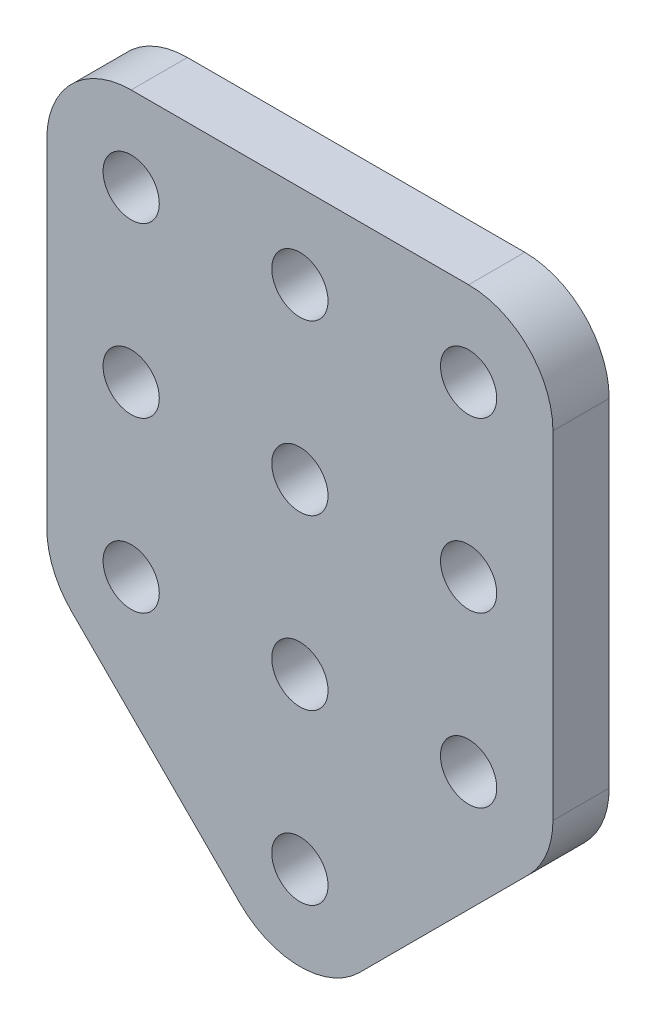
ISO-10303-21;
HEADER;
FILE_DESCRIPTION(('STEP AP214'),'2;1');
FILE_NAME('part.step','',(''),(''),'','','');
FILE_SCHEMA(('AUTOMOTIVE_DESIGN { 1 0 10303 214 1 1 1 1 }'));
ENDSEC;
DATA;
#1=APPLICATION_CONTEXT('core data for automotive mechanical design processes');
#2=APPLICATION_PROTOCOL_DEFINITION('international standard','automotive_design',2000,#1);
#3=PRODUCT_CONTEXT('',#1,'mechanical');
#4=PRODUCT('Part','Part','',(#3));
#5=PRODUCT_RELATED_PRODUCT_CATEGORY('part','',(#4));
#6=PRODUCT_DEFINITION_FORMATION('','',#4);
#7=PRODUCT_DEFINITION_CONTEXT('part definition',#1,'design');
#8=PRODUCT_DEFINITION('design','',#6,#7);
#9=PRODUCT_DEFINITION_SHAPE('','',#8);
#10=(LENGTH_UNIT() NAMED_UNIT(*) SI_UNIT(.MILLI.,.METRE.));
#11=(NAMED_UNIT(*) PLANE_ANGLE_UNIT() SI_UNIT($,.RADIAN.));
#12=(NAMED_UNIT(*) SI_UNIT($,.STERADIAN.) SOLID_ANGLE_UNIT());
#13=UNCERTAINTY_MEASURE_WITH_UNIT(LENGTH_MEASURE(1.E-05),#10,'distance_accuracy_value','');
#14=(GEOMETRIC_REPRESENTATION_CONTEXT(3) GLOBAL_UNCERTAINTY_ASSIGNED_CONTEXT((#13)) GLOBAL_UNIT_ASSIGNED_CONTEXT((#10,
#11,#12)) REPRESENTATION_CONTEXT('',''));
#15=CARTESIAN_POINT('',(0.,0.,0.));
#16=DIRECTION('',(0.,0.,1.));
#17=DIRECTION('',(1.,0.,0.));
#18=AXIS2_PLACEMENT_3D('',#15,#16,#17);
#19=CARTESIAN_POINT('',(187.7270545748,195.1787200631,3.));
#20=DIRECTION('',(0.,0.,1.));
#21=DIRECTION('',(1.,0.,0.));
#22=AXIS2_PLACEMENT_3D('',#19,#20,#21);
#23=PLANE('',#22);
#24=CARTESIAN_POINT('',(178.7270545748,222.1787200631,3.));
#25=DIRECTION('',(0.,0.,1.));
#26=DIRECTION('',(1.,0.,0.));
#27=AXIS2_PLACEMENT_3D('',#24,#25,#26);
#28=CIRCLE('',#27,1.5);
#29=CARTESIAN_POINT('',(180.2270545748,222.1787200631,3.));
#30=VERTEX_POINT('',#29);
#31=EDGE_CURVE('E253',#30,#30,#28,.T.);
#32=ORIENTED_EDGE('',*,*,#31,.F.);
#33=EDGE_LOOP('',(#32));
#34=FACE_BOUND('',#33,.T.);
#35=CARTESIAN_POINT('',(196.7270545748,204.1787200631,3.));
#36=DIRECTION('',(0.,0.,1.));
#37=DIRECTION('',(1.,0.,0.));
#38=AXIS2_PLACEMENT_3D('',#35,#36,#37);
#39=CIRCLE('',#38,1.5);
#40=CARTESIAN_POINT('',(198.2270545748,204.1787200631,3.));
#41=VERTEX_POINT('',#40);
#42=EDGE_CURVE('E241',#41,#41,#39,.T.);
#43=ORIENTED_EDGE('',*,*,#42,.F.);
#44=EDGE_LOOP('',(#43));
#45=FACE_BOUND('',#44,.T.);
#46=CARTESIAN_POINT('',(196.7270545748,213.1787200631,3.));
#47=DIRECTION('',(0.,0.,1.));
#48=DIRECTION('',(1.,0.,0.));
#49=AXIS2_PLACEMENT_3D('',#46,#47,#48);
#50=CIRCLE('',#49,1.5);
#51=CARTESIAN_POINT('',(198.2270545748,213.1787200631,3.));
#52=VERTEX_POINT('',#51);
#53=EDGE_CURVE('E229',#52,#52,#50,.T.);
#54=ORIENTED_EDGE('',*,*,#53,.F.);
#55=EDGE_LOOP('',(#54));
#56=FACE_BOUND('',#55,.T.);
#57=CARTESIAN_POINT('',(187.7270545748,213.1787200631,3.));
#58=DIRECTION('',(0.,0.,1.));
#59=DIRECTION('',(1.,0.,0.));
#60=AXIS2_PLACEMENT_3D('',#57,#58,#59);
#61=CIRCLE('',#60,1.5);
#62=CARTESIAN_POINT('',(189.2270545748,213.1787200631,3.));
#63=VERTEX_POINT('',#62);
#64=EDGE_CURVE('E217',#63,#63,#61,.T.);
#65=ORIENTED_EDGE('',*,*,#64,.F.);
#66=EDGE_LOOP('',(#65));
#67=FACE_BOUND('',#66,.T.);
#68=CARTESIAN_POINT('',(187.7270545748,204.1787200631,3.));
#69=DIRECTION('',(0.,0.,1.));
#70=DIRECTION('',(1.,0.,0.));
#71=AXIS2_PLACEMENT_3D('',#68,#69,#70);
#72=CIRCLE('',#71,1.5);
#73=CARTESIAN_POINT('',(189.2270545748,204.1787200631,3.));
#74=VERTEX_POINT('',#73);
#75=EDGE_CURVE('E144',#74,#74,#72,.T.);
#76=ORIENTED_EDGE('',*,*,#75,.F.);
#77=EDGE_LOOP('',(#76));
#78=FACE_BOUND('',#77,.T.);
#79=CARTESIAN_POINT('',(187.7270545748,195.1787200631,3.));
#80=DIRECTION('',(0.,0.,1.));
#81=DIRECTION('',(1.,0.,0.));
#82=AXIS2_PLACEMENT_3D('',#79,#80,#81);
#83=CIRCLE('',#82,4.50000000005025);
#84=CARTESIAN_POINT('',(184.5450740594,191.9967395477,3.));
#85=VERTEX_POINT('',#84);
#86=CARTESIAN_POINT('',(190.9090350901,191.9967395477,3.));
#87=VERTEX_POINT('',#86);
#88=EDGE_CURVE('E160',#85,#87,#83,.T.);
#89=ORIENTED_EDGE('',*,*,#88,.T.);
#90=DIRECTION('',(0.707106781186548,0.707106781186548,0.));
#91=VECTOR('',#90,1.);
#92=CARTESIAN_POINT('',(190.9090350901,191.9967395477,3.));
#93=LINE('',#92,#91);
#94=CARTESIAN_POINT('',(199.909035090095,200.996739547705,3.));
#95=VERTEX_POINT('',#94);
#96=EDGE_CURVE('E98',#87,#95,#93,.T.);
#97=ORIENTED_EDGE('',*,*,#96,.T.);
#98=CARTESIAN_POINT('',(196.7270545748,204.1787200631,3.));
#99=DIRECTION('',(0.,0.,1.));
#100=DIRECTION('',(1.,0.,0.));
#101=AXIS2_PLACEMENT_3D('',#98,#99,#100);
#102=CIRCLE('',#101,4.50000000000745);
#103=CARTESIAN_POINT('',(201.2270545748,204.1787200631,3.));
#104=VERTEX_POINT('',#103);
#105=EDGE_CURVE('E181',#95,#104,#102,.T.);
#106=ORIENTED_EDGE('',*,*,#105,.T.);
#107=DIRECTION('',(0.,1.,0.));
#108=VECTOR('',#107,1.);
#109=CARTESIAN_POINT('',(201.2270545748,222.1787200631,3.));
#110=LINE('',#109,#108);
#111=CARTESIAN_POINT('',(201.2270545748,222.1787200631,3.));
#112=VERTEX_POINT('',#111);
#113=EDGE_CURVE('E200',#104,#112,#110,.T.);
#114=ORIENTED_EDGE('',*,*,#113,.T.);
#115=CARTESIAN_POINT('',(196.7270545748,222.1787200631,3.));
#116=DIRECTION('',(0.,0.,1.));
#117=DIRECTION('',(1.,0.,0.));
#118=AXIS2_PLACEMENT_3D('',#115,#116,#117);
#119=CIRCLE('',#118,4.5);
#120=CARTESIAN_POINT('',(196.7270545748,226.6787200631,3.));
#121=VERTEX_POINT('',#120);
#122=EDGE_CURVE('E197',#112,#121,#119,.T.);
#123=ORIENTED_EDGE('',*,*,#122,.T.);
#124=DIRECTION('',(-1.,0.,0.));
#125=VECTOR('',#124,1.);
#126=CARTESIAN_POINT('',(196.7270545748,226.6787200631,3.));
#127=LINE('',#126,#125);
#128=CARTESIAN_POINT('',(178.7270545748,226.6787200631,3.));
#129=VERTEX_POINT('',#128);
#130=EDGE_CURVE('E199',#121,#129,#127,.T.);
#131=ORIENTED_EDGE('',*,*,#130,.T.);
#132=CARTESIAN_POINT('',(178.7270545748,222.1787200631,3.));
#133=DIRECTION('',(0.,0.,1.));
#134=DIRECTION('',(1.,0.,0.));
#135=AXIS2_PLACEMENT_3D('',#132,#133,#134);
#136=CIRCLE('',#135,4.5);
#137=CARTESIAN_POINT('',(174.2270545748,222.1787200631,3.));
#138=VERTEX_POINT('',#137);
#139=EDGE_CURVE('E123',#129,#138,#136,.T.);
#140=ORIENTED_EDGE('',*,*,#139,.T.);
#141=DIRECTION('',(0.,-1.,0.));
#142=VECTOR('',#141,1.);
#143=CARTESIAN_POINT('',(174.2270545748,213.1787200631,3.));
#144=LINE('',#143,#142);
#145=CARTESIAN_POINT('',(174.227054574757,204.1787200631,3.));
#146=VERTEX_POINT('',#145);
#147=EDGE_CURVE('E117',#138,#146,#144,.T.);
#148=ORIENTED_EDGE('',*,*,#147,.T.);
#149=CARTESIAN_POINT('',(178.7270545748,204.1787200631,3.));
#150=DIRECTION('',(0.,0.,1.));
#151=DIRECTION('',(1.,0.,0.));
#152=AXIS2_PLACEMENT_3D('',#149,#150,#151);
#153=CIRCLE('',#152,4.50000000004281);
#154=CARTESIAN_POINT('',(175.5450740594,200.9967395477,3.));
#155=VERTEX_POINT('',#154);
#156=EDGE_CURVE('E121',#146,#155,#153,.T.);
#157=ORIENTED_EDGE('',*,*,#156,.T.);
#158=DIRECTION('',(0.707106781186548,-0.707106781186548,0.));
#159=VECTOR('',#158,1.);
#160=CARTESIAN_POINT('',(184.5450740594,191.9967395477,3.));
#161=LINE('',#160,#159);
#162=EDGE_CURVE('E49',#155,#85,#161,.T.);
#163=ORIENTED_EDGE('',*,*,#162,.T.);
#164=EDGE_LOOP('',(#89,#97,#106,#114,#123,#131,#140,#148,#157,#163));
#165=FACE_BOUND('',#164,.T.);
#166=CARTESIAN_POINT('',(178.7270545748,204.1787200631,3.));
#167=DIRECTION('',(0.,0.,1.));
#168=DIRECTION('',(1.,0.,0.));
#169=AXIS2_PLACEMENT_3D('',#166,#167,#168);
#170=CIRCLE('',#169,1.5);
#171=CARTESIAN_POINT('',(180.2270545748,204.1787200631,3.));
#172=VERTEX_POINT('',#171);
#173=EDGE_CURVE('E211',#172,#172,#170,.T.);
#174=ORIENTED_EDGE('',*,*,#173,.F.);
#175=EDGE_LOOP('',(#174));
#176=FACE_BOUND('',#175,.T.);
#177=CARTESIAN_POINT('',(178.7270545748,213.1787200631,3.));
#178=DIRECTION('',(0.,0.,1.));
#179=DIRECTION('',(1.,0.,0.));
#180=AXIS2_PLACEMENT_3D('',#177,#178,#179);
#181=CIRCLE('',#180,1.5);
#182=CARTESIAN_POINT('',(180.2270545748,213.1787200631,3.));
#183=VERTEX_POINT('',#182);
#184=EDGE_CURVE('E223',#183,#183,#181,.T.);
#185=ORIENTED_EDGE('',*,*,#184,.F.);
#186=EDGE_LOOP('',(#185));
#187=FACE_BOUND('',#186,.T.);
#188=CARTESIAN_POINT('',(187.7270545748,195.1787200631,3.));
#189=DIRECTION('',(0.,0.,1.));
#190=DIRECTION('',(1.,0.,0.));
#191=AXIS2_PLACEMENT_3D('',#188,#189,#190);
#192=CIRCLE('',#191,1.5);
#193=CARTESIAN_POINT('',(189.2270545748,195.1787200631,3.));
#194=VERTEX_POINT('',#193);
#195=EDGE_CURVE('E235',#194,#194,#192,.T.);
#196=ORIENTED_EDGE('',*,*,#195,.F.);
#197=EDGE_LOOP('',(#196));
#198=FACE_BOUND('',#197,.T.);
#199=CARTESIAN_POINT('',(187.7270545748,222.1787200631,3.));
#200=DIRECTION('',(0.,0.,1.));
#201=DIRECTION('',(1.,0.,0.));
#202=AXIS2_PLACEMENT_3D('',#199,#200,#201);
#203=CIRCLE('',#202,1.5);
#204=CARTESIAN_POINT('',(189.2270545748,222.1787200631,3.));
#205=VERTEX_POINT('',#204);
#206=EDGE_CURVE('E247',#205,#205,#203,.T.);
#207=ORIENTED_EDGE('',*,*,#206,.F.);
#208=EDGE_LOOP('',(#207));
#209=FACE_BOUND('',#208,.T.);
#210=CARTESIAN_POINT('',(196.7270545748,222.1787200631,3.));
#211=DIRECTION('',(0.,0.,1.));
#212=DIRECTION('',(1.,0.,0.));
#213=AXIS2_PLACEMENT_3D('',#210,#211,#212);
#214=CIRCLE('',#213,1.5);
#215=CARTESIAN_POINT('',(198.2270545748,222.1787200631,3.));
#216=VERTEX_POINT('',#215);
#217=EDGE_CURVE('E259',#216,#216,#214,.T.);
#218=ORIENTED_EDGE('',*,*,#217,.F.);
#219=EDGE_LOOP('',(#218));
#220=FACE_BOUND('',#219,.T.);
#221=ADVANCED_FACE('F32',(#34,#45,#56,#67,#78,#165,#176,#187,#198,#209,#220),#23,.T.);
#222=CARTESIAN_POINT('',(187.7270545748,195.1787200631,0.));
#223=DIRECTION('',(0.,0.,1.));
#224=DIRECTION('',(1.,0.,0.));
#225=AXIS2_PLACEMENT_3D('',#222,#223,#224);
#226=PLANE('',#225);
#227=CARTESIAN_POINT('',(178.7270545748,222.1787200631,0.));
#228=DIRECTION('',(0.,0.,1.));
#229=DIRECTION('',(1.,0.,0.));
#230=AXIS2_PLACEMENT_3D('',#227,#228,#229);
#231=CIRCLE('',#230,1.5);
#232=CARTESIAN_POINT('',(180.2270545748,222.1787200631,0.));
#233=VERTEX_POINT('',#232);
#234=EDGE_CURVE('E256',#233,#233,#231,.T.);
#235=ORIENTED_EDGE('',*,*,#234,.T.);
#236=EDGE_LOOP('',(#235));
#237=FACE_BOUND('',#236,.T.);
#238=CARTESIAN_POINT('',(196.7270545748,204.1787200631,0.));
#239=DIRECTION('',(0.,0.,1.));
#240=DIRECTION('',(1.,0.,0.));
#241=AXIS2_PLACEMENT_3D('',#238,#239,#240);
#242=CIRCLE('',#241,1.5);
#243=CARTESIAN_POINT('',(198.2270545748,204.1787200631,0.));
#244=VERTEX_POINT('',#243);
#245=EDGE_CURVE('E244',#244,#244,#242,.T.);
#246=ORIENTED_EDGE('',*,*,#245,.T.);
#247=EDGE_LOOP('',(#246));
#248=FACE_BOUND('',#247,.T.);
#249=CARTESIAN_POINT('',(196.7270545748,213.1787200631,0.));
#250=DIRECTION('',(0.,0.,1.));
#251=DIRECTION('',(1.,0.,0.));
#252=AXIS2_PLACEMENT_3D('',#249,#250,#251);
#253=CIRCLE('',#252,1.5);
#254=CARTESIAN_POINT('',(198.2270545748,213.1787200631,0.));
#255=VERTEX_POINT('',#254);
#256=EDGE_CURVE('E232',#255,#255,#253,.T.);
#257=ORIENTED_EDGE('',*,*,#256,.T.);
#258=EDGE_LOOP('',(#257));
#259=FACE_BOUND('',#258,.T.);
#260=CARTESIAN_POINT('',(187.7270545748,213.1787200631,0.));
#261=DIRECTION('',(0.,0.,1.));
#262=DIRECTION('',(1.,0.,0.));
#263=AXIS2_PLACEMENT_3D('',#260,#261,#262);
#264=CIRCLE('',#263,1.5);
#265=CARTESIAN_POINT('',(189.2270545748,213.1787200631,0.));
#266=VERTEX_POINT('',#265);
#267=EDGE_CURVE('E220',#266,#266,#264,.T.);
#268=ORIENTED_EDGE('',*,*,#267,.T.);
#269=EDGE_LOOP('',(#268));
#270=FACE_BOUND('',#269,.T.);
#271=CARTESIAN_POINT('',(187.7270545748,204.1787200631,0.));
#272=DIRECTION('',(0.,0.,1.));
#273=DIRECTION('',(1.,0.,0.));
#274=AXIS2_PLACEMENT_3D('',#271,#272,#273);
#275=CIRCLE('',#274,1.5);
#276=CARTESIAN_POINT('',(189.2270545748,204.1787200631,0.));
#277=VERTEX_POINT('',#276);
#278=EDGE_CURVE('E208',#277,#277,#275,.T.);
#279=ORIENTED_EDGE('',*,*,#278,.T.);
#280=EDGE_LOOP('',(#279));
#281=FACE_BOUND('',#280,.T.);
#282=CARTESIAN_POINT('',(187.7270545748,195.1787200631,0.));
#283=DIRECTION('',(0.,0.,1.));
#284=DIRECTION('',(1.,0.,0.));
#285=AXIS2_PLACEMENT_3D('',#282,#283,#284);
#286=CIRCLE('',#285,4.50000000005025);
#287=CARTESIAN_POINT('',(184.5450740594,191.9967395477,0.));
#288=VERTEX_POINT('',#287);
#289=CARTESIAN_POINT('',(190.9090350901,191.9967395477,0.));
#290=VERTEX_POINT('',#289);
#291=EDGE_CURVE('E140',#288,#290,#286,.T.);
#292=ORIENTED_EDGE('',*,*,#291,.F.);
#293=DIRECTION('',(0.707106781186548,-0.707106781186548,0.));
#294=VECTOR('',#293,1.);
#295=CARTESIAN_POINT('',(184.5450740594,191.9967395477,0.));
#296=LINE('',#295,#294);
#297=CARTESIAN_POINT('',(175.5450740594,200.9967395477,0.));
#298=VERTEX_POINT('',#297);
#299=EDGE_CURVE('E90',#298,#288,#296,.T.);
#300=ORIENTED_EDGE('',*,*,#299,.F.);
#301=CARTESIAN_POINT('',(178.7270545748,204.1787200631,0.));
#302=DIRECTION('',(0.,0.,1.));
#303=DIRECTION('',(1.,0.,0.));
#304=AXIS2_PLACEMENT_3D('',#301,#302,#303);
#305=CIRCLE('',#304,4.50000000004281);
#306=CARTESIAN_POINT('',(174.227054574757,204.1787200631,0.));
#307=VERTEX_POINT('',#306);
#308=EDGE_CURVE('E84',#307,#298,#305,.T.);
#309=ORIENTED_EDGE('',*,*,#308,.F.);
#310=DIRECTION('',(0.,-1.,0.));
#311=VECTOR('',#310,1.);
#312=CARTESIAN_POINT('',(174.2270545748,213.1787200631,0.));
#313=LINE('',#312,#311);
#314=CARTESIAN_POINT('',(174.2270545748,222.1787200631,0.));
#315=VERTEX_POINT('',#314);
#316=EDGE_CURVE('E130',#315,#307,#313,.T.);
#317=ORIENTED_EDGE('',*,*,#316,.F.);
#318=CARTESIAN_POINT('',(178.7270545748,222.1787200631,0.));
#319=DIRECTION('',(0.,0.,1.));
#320=DIRECTION('',(1.,0.,0.));
#321=AXIS2_PLACEMENT_3D('',#318,#319,#320);
#322=CIRCLE('',#321,4.5);
#323=CARTESIAN_POINT('',(178.7270545748,226.6787200631,0.));
#324=VERTEX_POINT('',#323);
#325=EDGE_CURVE('E154',#324,#315,#322,.T.);
#326=ORIENTED_EDGE('',*,*,#325,.F.);
#327=DIRECTION('',(-1.,0.,0.));
#328=VECTOR('',#327,1.);
#329=CARTESIAN_POINT('',(196.7270545748,226.6787200631,0.));
#330=LINE('',#329,#328);
#331=CARTESIAN_POINT('',(196.7270545748,226.6787200631,0.));
#332=VERTEX_POINT('',#331);
#333=EDGE_CURVE('E152',#332,#324,#330,.T.);
#334=ORIENTED_EDGE('',*,*,#333,.F.);
#335=CARTESIAN_POINT('',(196.7270545748,222.1787200631,0.));
#336=DIRECTION('',(0.,0.,1.));
#337=DIRECTION('',(1.,0.,0.));
#338=AXIS2_PLACEMENT_3D('',#335,#336,#337);
#339=CIRCLE('',#338,4.5);
#340=CARTESIAN_POINT('',(201.2270545748,222.1787200631,0.));
#341=VERTEX_POINT('',#340);
#342=EDGE_CURVE('E150',#341,#332,#339,.T.);
#343=ORIENTED_EDGE('',*,*,#342,.F.);
#344=DIRECTION('',(0.,1.,0.));
#345=VECTOR('',#344,1.);
#346=CARTESIAN_POINT('',(201.2270545748,222.1787200631,0.));
#347=LINE('',#346,#345);
#348=CARTESIAN_POINT('',(201.2270545748,204.1787200631,0.));
#349=VERTEX_POINT('',#348);
#350=EDGE_CURVE('E148',#349,#341,#347,.T.);
#351=ORIENTED_EDGE('',*,*,#350,.F.);
#352=CARTESIAN_POINT('',(196.7270545748,204.1787200631,0.));
#353=DIRECTION('',(0.,0.,1.));
#354=DIRECTION('',(1.,0.,0.));
#355=AXIS2_PLACEMENT_3D('',#352,#353,#354);
#356=CIRCLE('',#355,4.50000000000745);
#357=CARTESIAN_POINT('',(199.909035090095,200.996739547705,0.));
#358=VERTEX_POINT('',#357);
#359=EDGE_CURVE('E146',#358,#349,#356,.T.);
#360=ORIENTED_EDGE('',*,*,#359,.F.);
#361=DIRECTION('',(0.707106781186548,0.707106781186548,0.));
#362=VECTOR('',#361,1.);
#363=CARTESIAN_POINT('',(190.9090350901,191.9967395477,0.));
#364=LINE('',#363,#362);
#365=EDGE_CURVE('E143',#290,#358,#364,.T.);
#366=ORIENTED_EDGE('',*,*,#365,.F.);
#367=EDGE_LOOP('',(#292,#300,#309,#317,#326,#334,#343,#351,#360,#366));
#368=FACE_BOUND('',#367,.T.);
#369=CARTESIAN_POINT('',(178.7270545748,204.1787200631,0.));
#370=DIRECTION('',(0.,0.,1.));
#371=DIRECTION('',(1.,0.,0.));
#372=AXIS2_PLACEMENT_3D('',#369,#370,#371);
#373=CIRCLE('',#372,1.5);
#374=CARTESIAN_POINT('',(180.2270545748,204.1787200631,0.));
#375=VERTEX_POINT('',#374);
#376=EDGE_CURVE('E214',#375,#375,#373,.T.);
#377=ORIENTED_EDGE('',*,*,#376,.T.);
#378=EDGE_LOOP('',(#377));
#379=FACE_BOUND('',#378,.T.);
#380=CARTESIAN_POINT('',(178.7270545748,213.1787200631,0.));
#381=DIRECTION('',(0.,0.,1.));
#382=DIRECTION('',(1.,0.,0.));
#383=AXIS2_PLACEMENT_3D('',#380,#381,#382);
#384=CIRCLE('',#383,1.5);
#385=CARTESIAN_POINT('',(180.2270545748,213.1787200631,0.));
#386=VERTEX_POINT('',#385);
#387=EDGE_CURVE('E226',#386,#386,#384,.T.);
#388=ORIENTED_EDGE('',*,*,#387,.T.);
#389=EDGE_LOOP('',(#388));
#390=FACE_BOUND('',#389,.T.);
#391=CARTESIAN_POINT('',(187.7270545748,195.1787200631,0.));
#392=DIRECTION('',(0.,0.,1.));
#393=DIRECTION('',(1.,0.,0.));
#394=AXIS2_PLACEMENT_3D('',#391,#392,#393);
#395=CIRCLE('',#394,1.5);
#396=CARTESIAN_POINT('',(189.2270545748,195.1787200631,0.));
#397=VERTEX_POINT('',#396);
#398=EDGE_CURVE('E238',#397,#397,#395,.T.);
#399=ORIENTED_EDGE('',*,*,#398,.T.);
#400=EDGE_LOOP('',(#399));
#401=FACE_BOUND('',#400,.T.);
#402=CARTESIAN_POINT('',(187.7270545748,222.1787200631,0.));
#403=DIRECTION('',(0.,0.,1.));
#404=DIRECTION('',(1.,0.,0.));
#405=AXIS2_PLACEMENT_3D('',#402,#403,#404);
#406=CIRCLE('',#405,1.5);
#407=CARTESIAN_POINT('',(189.2270545748,222.1787200631,0.));
#408=VERTEX_POINT('',#407);
#409=EDGE_CURVE('E250',#408,#408,#406,.T.);
#410=ORIENTED_EDGE('',*,*,#409,.T.);
#411=EDGE_LOOP('',(#410));
#412=FACE_BOUND('',#411,.T.);
#413=CARTESIAN_POINT('',(196.7270545748,222.1787200631,0.));
#414=DIRECTION('',(0.,0.,1.));
#415=DIRECTION('',(1.,0.,0.));
#416=AXIS2_PLACEMENT_3D('',#413,#414,#415);
#417=CIRCLE('',#416,1.5);
#418=CARTESIAN_POINT('',(198.2270545748,222.1787200631,0.));
#419=VERTEX_POINT('',#418);
#420=EDGE_CURVE('E262',#419,#419,#417,.T.);
#421=ORIENTED_EDGE('',*,*,#420,.T.);
#422=EDGE_LOOP('',(#421));
#423=FACE_BOUND('',#422,.T.);
#424=ADVANCED_FACE('F185',(#237,#248,#259,#270,#281,#368,#379,#390,#401,#412,#423),#226,.F.);
#425=CARTESIAN_POINT('',(187.7270545748,195.1787200631,3.));
#426=DIRECTION('',(0.,0.,-1.));
#427=DIRECTION('',(-1.,0.,0.));
#428=AXIS2_PLACEMENT_3D('',#425,#426,#427);
#429=CYLINDRICAL_SURFACE('',#428,4.50000000005025);
#430=ORIENTED_EDGE('',*,*,#291,.T.);
#431=DIRECTION('',(0.,0.,-1.));
#432=VECTOR('',#431,1.);
#433=CARTESIAN_POINT('',(190.9090350901,191.9967395477,3.));
#434=LINE('',#433,#432);
#435=EDGE_CURVE('E11',#87,#290,#434,.T.);
#436=ORIENTED_EDGE('',*,*,#435,.F.);
#437=ORIENTED_EDGE('',*,*,#88,.F.);
#438=DIRECTION('',(0.,0.,-1.));
#439=VECTOR('',#438,1.);
#440=CARTESIAN_POINT('',(184.5450740594,191.9967395477,3.));
#441=LINE('',#440,#439);
#442=EDGE_CURVE('E136',#85,#288,#441,.T.);
#443=ORIENTED_EDGE('',*,*,#442,.T.);
#444=EDGE_LOOP('',(#430,#436,#437,#443));
#445=FACE_BOUND('',#444,.T.);
#446=ADVANCED_FACE('F34',(#445),#429,.T.);
#447=CARTESIAN_POINT('',(190.9090350901,191.9967395477,3.));
#448=DIRECTION('',(-0.707106781186547,0.707106781186547,0.));
#449=DIRECTION('',(-0.707106781186548,-0.707106781186548,0.));
#450=AXIS2_PLACEMENT_3D('',#447,#448,#449);
#451=PLANE('',#450);
#452=ORIENTED_EDGE('',*,*,#365,.T.);
#453=DIRECTION('',(0.,0.,-1.));
#454=VECTOR('',#453,1.);
#455=CARTESIAN_POINT('',(199.909035090095,200.996739547705,3.));
#456=LINE('',#455,#454);
#457=EDGE_CURVE('E41',#95,#358,#456,.T.);
#458=ORIENTED_EDGE('',*,*,#457,.F.);
#459=ORIENTED_EDGE('',*,*,#96,.F.);
#460=ORIENTED_EDGE('',*,*,#435,.T.);
#461=EDGE_LOOP('',(#452,#458,#459,#460));
#462=FACE_BOUND('',#461,.T.);
#463=ADVANCED_FACE('F305',(#462),#451,.F.);
#464=CARTESIAN_POINT('',(196.7270545748,204.1787200631,3.));
#465=DIRECTION('',(0.,0.,-1.));
#466=DIRECTION('',(-1.,0.,0.));
#467=AXIS2_PLACEMENT_3D('',#464,#465,#466);
#468=CYLINDRICAL_SURFACE('',#467,4.50000000000745);
#469=ORIENTED_EDGE('',*,*,#359,.T.);
#470=DIRECTION('',(0.,0.,-1.));
#471=VECTOR('',#470,1.);
#472=CARTESIAN_POINT('',(201.2270545748,204.1787200631,3.));
#473=LINE('',#472,#471);
#474=EDGE_CURVE('E173',#104,#349,#473,.T.);
#475=ORIENTED_EDGE('',*,*,#474,.F.);
#476=ORIENTED_EDGE('',*,*,#105,.F.);
#477=ORIENTED_EDGE('',*,*,#457,.T.);
#478=EDGE_LOOP('',(#469,#475,#476,#477));
#479=FACE_BOUND('',#478,.T.);
#480=ADVANCED_FACE('F179',(#479),#468,.T.);
#481=CARTESIAN_POINT('',(201.2270545748,222.1787200631,3.));
#482=DIRECTION('',(-1.,0.,0.));
#483=DIRECTION('',(0.,0.,1.));
#484=AXIS2_PLACEMENT_3D('',#481,#482,#483);
#485=PLANE('',#484);
#486=ORIENTED_EDGE('',*,*,#350,.T.);
#487=DIRECTION('',(0.,0.,-1.));
#488=VECTOR('',#487,1.);
#489=CARTESIAN_POINT('',(201.2270545748,222.1787200631,3.));
#490=LINE('',#489,#488);
#491=EDGE_CURVE('E170',#112,#341,#490,.T.);
#492=ORIENTED_EDGE('',*,*,#491,.F.);
#493=ORIENTED_EDGE('',*,*,#113,.F.);
#494=ORIENTED_EDGE('',*,*,#474,.T.);
#495=EDGE_LOOP('',(#486,#492,#493,#494));
#496=FACE_BOUND('',#495,.T.);
#497=ADVANCED_FACE('F191',(#496),#485,.F.);
#498=CARTESIAN_POINT('',(196.7270545748,222.1787200631,3.));
#499=DIRECTION('',(0.,0.,-1.));
#500=DIRECTION('',(-1.,0.,0.));
#501=AXIS2_PLACEMENT_3D('',#498,#499,#500);
#502=CYLINDRICAL_SURFACE('',#501,4.5);
#503=ORIENTED_EDGE('',*,*,#342,.T.);
#504=DIRECTION('',(0.,0.,-1.));
#505=VECTOR('',#504,1.);
#506=CARTESIAN_POINT('',(196.7270545748,226.6787200631,3.));
#507=LINE('',#506,#505);
#508=EDGE_CURVE('E167',#121,#332,#507,.T.);
#509=ORIENTED_EDGE('',*,*,#508,.F.);
#510=ORIENTED_EDGE('',*,*,#122,.F.);
#511=ORIENTED_EDGE('',*,*,#491,.T.);
#512=EDGE_LOOP('',(#503,#509,#510,#511));
#513=FACE_BOUND('',#512,.T.);
#514=ADVANCED_FACE('F195',(#513),#502,.T.);
#515=CARTESIAN_POINT('',(196.7270545748,226.6787200631,3.));
#516=DIRECTION('',(0.,-1.,0.));
#517=DIRECTION('',(0.,0.,-1.));
#518=AXIS2_PLACEMENT_3D('',#515,#516,#517);
#519=PLANE('',#518);
#520=ORIENTED_EDGE('',*,*,#333,.T.);
#521=DIRECTION('',(0.,0.,-1.));
#522=VECTOR('',#521,1.);
#523=CARTESIAN_POINT('',(178.7270545748,226.6787200631,3.));
#524=LINE('',#523,#522);
#525=EDGE_CURVE('E164',#129,#324,#524,.T.);
#526=ORIENTED_EDGE('',*,*,#525,.F.);
#527=ORIENTED_EDGE('',*,*,#130,.F.);
#528=ORIENTED_EDGE('',*,*,#508,.T.);
#529=EDGE_LOOP('',(#520,#526,#527,#528));
#530=FACE_BOUND('',#529,.T.);
#531=ADVANCED_FACE('F295',(#530),#519,.F.);
#532=CARTESIAN_POINT('',(178.7270545748,222.1787200631,3.));
#533=DIRECTION('',(0.,0.,-1.));
#534=DIRECTION('',(-1.,0.,0.));
#535=AXIS2_PLACEMENT_3D('',#532,#533,#534);
#536=CYLINDRICAL_SURFACE('',#535,4.5);
#537=ORIENTED_EDGE('',*,*,#325,.T.);
#538=DIRECTION('',(0.,0.,-1.));
#539=VECTOR('',#538,1.);
#540=CARTESIAN_POINT('',(174.2270545748,222.1787200631,3.));
#541=LINE('',#540,#539);
#542=EDGE_CURVE('E131',#138,#315,#541,.T.);
#543=ORIENTED_EDGE('',*,*,#542,.F.);
#544=ORIENTED_EDGE('',*,*,#139,.F.);
#545=ORIENTED_EDGE('',*,*,#525,.T.);
#546=EDGE_LOOP('',(#537,#543,#544,#545));
#547=FACE_BOUND('',#546,.T.);
#548=ADVANCED_FACE('F292',(#547),#536,.T.);
#549=CARTESIAN_POINT('',(174.2270545748,213.1787200631,3.));
#550=DIRECTION('',(1.,0.,0.));
#551=DIRECTION('',(0.,0.,-1.));
#552=AXIS2_PLACEMENT_3D('',#549,#550,#551);
#553=PLANE('',#552);
#554=ORIENTED_EDGE('',*,*,#316,.T.);
#555=DIRECTION('',(0.,0.,-1.));
#556=VECTOR('',#555,1.);
#557=CARTESIAN_POINT('',(174.227054574757,204.1787200631,3.));
#558=LINE('',#557,#556);
#559=EDGE_CURVE('E128',#146,#307,#558,.T.);
#560=ORIENTED_EDGE('',*,*,#559,.F.);
#561=ORIENTED_EDGE('',*,*,#147,.F.);
#562=ORIENTED_EDGE('',*,*,#542,.T.);
#563=EDGE_LOOP('',(#554,#560,#561,#562));
#564=FACE_BOUND('',#563,.T.);
#565=ADVANCED_FACE('F129',(#564),#553,.F.);
#566=CARTESIAN_POINT('',(178.7270545748,204.1787200631,3.));
#567=DIRECTION('',(0.,0.,-1.));
#568=DIRECTION('',(-1.,0.,0.));
#569=AXIS2_PLACEMENT_3D('',#566,#567,#568);
#570=CYLINDRICAL_SURFACE('',#569,4.50000000004281);
#571=ORIENTED_EDGE('',*,*,#308,.T.);
#572=DIRECTION('',(0.,0.,-1.));
#573=VECTOR('',#572,1.);
#574=CARTESIAN_POINT('',(175.5450740594,200.9967395477,3.));
#575=LINE('',#574,#573);
#576=EDGE_CURVE('E132',#155,#298,#575,.T.);
#577=ORIENTED_EDGE('',*,*,#576,.F.);
#578=ORIENTED_EDGE('',*,*,#156,.F.);
#579=ORIENTED_EDGE('',*,*,#559,.T.);
#580=EDGE_LOOP('',(#571,#577,#578,#579));
#581=FACE_BOUND('',#580,.T.);
#582=ADVANCED_FACE('F134',(#581),#570,.T.);
#583=CARTESIAN_POINT('',(184.5450740594,191.9967395477,3.));
#584=DIRECTION('',(0.707106781186547,0.707106781186547,0.));
#585=DIRECTION('',(-0.707106781186548,0.707106781186548,0.));
#586=AXIS2_PLACEMENT_3D('',#583,#584,#585);
#587=PLANE('',#586);
#588=ORIENTED_EDGE('',*,*,#299,.T.);
#589=ORIENTED_EDGE('',*,*,#442,.F.);
#590=ORIENTED_EDGE('',*,*,#162,.F.);
#591=ORIENTED_EDGE('',*,*,#576,.T.);
#592=EDGE_LOOP('',(#588,#589,#590,#591));
#593=FACE_BOUND('',#592,.T.);
#594=ADVANCED_FACE('F285',(#593),#587,.F.);
#595=CARTESIAN_POINT('',(187.7270545748,204.1787200631,3.));
#596=DIRECTION('',(0.,0.,-1.));
#597=DIRECTION('',(-1.,0.,0.));
#598=AXIS2_PLACEMENT_3D('',#595,#596,#597);
#599=CYLINDRICAL_SURFACE('',#598,1.5);
#600=ORIENTED_EDGE('',*,*,#75,.T.);
#601=EDGE_LOOP('',(#600));
#602=FACE_BOUND('',#601,.T.);
#603=ORIENTED_EDGE('',*,*,#278,.F.);
#604=EDGE_LOOP('',(#603));
#605=FACE_BOUND('',#604,.T.);
#606=ADVANCED_FACE('F282',(#602,#605),#599,.F.);
#607=CARTESIAN_POINT('',(178.7270545748,204.1787200631,3.));
#608=DIRECTION('',(0.,0.,-1.));
#609=DIRECTION('',(-1.,0.,0.));
#610=AXIS2_PLACEMENT_3D('',#607,#608,#609);
#611=CYLINDRICAL_SURFACE('',#610,1.5);
#612=ORIENTED_EDGE('',*,*,#173,.T.);
#613=EDGE_LOOP('',(#612));
#614=FACE_BOUND('',#613,.T.);
#615=ORIENTED_EDGE('',*,*,#376,.F.);
#616=EDGE_LOOP('',(#615));
#617=FACE_BOUND('',#616,.T.);
#618=ADVANCED_FACE('F384',(#614,#617),#611,.F.);
#619=CARTESIAN_POINT('',(187.7270545748,213.1787200631,3.));
#620=DIRECTION('',(0.,0.,-1.));
#621=DIRECTION('',(-1.,0.,0.));
#622=AXIS2_PLACEMENT_3D('',#619,#620,#621);
#623=CYLINDRICAL_SURFACE('',#622,1.5);
#624=ORIENTED_EDGE('',*,*,#64,.T.);
#625=EDGE_LOOP('',(#624));
#626=FACE_BOUND('',#625,.T.);
#627=ORIENTED_EDGE('',*,*,#267,.F.);
#628=EDGE_LOOP('',(#627));
#629=FACE_BOUND('',#628,.T.);
#630=ADVANCED_FACE('F392',(#626,#629),#623,.F.);
#631=CARTESIAN_POINT('',(178.7270545748,213.1787200631,3.));
#632=DIRECTION('',(0.,0.,-1.));
#633=DIRECTION('',(-1.,0.,0.));
#634=AXIS2_PLACEMENT_3D('',#631,#632,#633);
#635=CYLINDRICAL_SURFACE('',#634,1.5);
#636=ORIENTED_EDGE('',*,*,#184,.T.);
#637=EDGE_LOOP('',(#636));
#638=FACE_BOUND('',#637,.T.);
#639=ORIENTED_EDGE('',*,*,#387,.F.);
#640=EDGE_LOOP('',(#639));
#641=FACE_BOUND('',#640,.T.);
#642=ADVANCED_FACE('F400',(#638,#641),#635,.F.);
#643=CARTESIAN_POINT('',(196.7270545748,213.1787200631,3.));
#644=DIRECTION('',(0.,0.,-1.));
#645=DIRECTION('',(-1.,0.,0.));
#646=AXIS2_PLACEMENT_3D('',#643,#644,#645);
#647=CYLINDRICAL_SURFACE('',#646,1.5);
#648=ORIENTED_EDGE('',*,*,#53,.T.);
#649=EDGE_LOOP('',(#648));
#650=FACE_BOUND('',#649,.T.);
#651=ORIENTED_EDGE('',*,*,#256,.F.);
#652=EDGE_LOOP('',(#651));
#653=FACE_BOUND('',#652,.T.);
#654=ADVANCED_FACE('F409',(#650,#653),#647,.F.);
#655=CARTESIAN_POINT('',(187.7270545748,195.1787200631,3.));
#656=DIRECTION('',(0.,0.,-1.));
#657=DIRECTION('',(-1.,0.,0.));
#658=AXIS2_PLACEMENT_3D('',#655,#656,#657);
#659=CYLINDRICAL_SURFACE('',#658,1.5);
#660=ORIENTED_EDGE('',*,*,#195,.T.);
#661=EDGE_LOOP('',(#660));
#662=FACE_BOUND('',#661,.T.);
#663=ORIENTED_EDGE('',*,*,#398,.F.);
#664=EDGE_LOOP('',(#663));
#665=FACE_BOUND('',#664,.T.);
#666=ADVANCED_FACE('F418',(#662,#665),#659,.F.);
#667=CARTESIAN_POINT('',(196.7270545748,204.1787200631,3.));
#668=DIRECTION('',(0.,0.,-1.));
#669=DIRECTION('',(-1.,0.,0.));
#670=AXIS2_PLACEMENT_3D('',#667,#668,#669);
#671=CYLINDRICAL_SURFACE('',#670,1.5);
#672=ORIENTED_EDGE('',*,*,#42,.T.);
#673=EDGE_LOOP('',(#672));
#674=FACE_BOUND('',#673,.T.);
#675=ORIENTED_EDGE('',*,*,#245,.F.);
#676=EDGE_LOOP('',(#675));
#677=FACE_BOUND('',#676,.T.);
#678=ADVANCED_FACE('F427',(#674,#677),#671,.F.);
#679=CARTESIAN_POINT('',(187.7270545748,222.1787200631,3.));
#680=DIRECTION('',(0.,0.,-1.));
#681=DIRECTION('',(-1.,0.,0.));
#682=AXIS2_PLACEMENT_3D('',#679,#680,#681);
#683=CYLINDRICAL_SURFACE('',#682,1.5);
#684=ORIENTED_EDGE('',*,*,#206,.T.);
#685=EDGE_LOOP('',(#684));
#686=FACE_BOUND('',#685,.T.);
#687=ORIENTED_EDGE('',*,*,#409,.F.);
#688=EDGE_LOOP('',(#687));
#689=FACE_BOUND('',#688,.T.);
#690=ADVANCED_FACE('F436',(#686,#689),#683,.F.);
#691=CARTESIAN_POINT('',(178.7270545748,222.1787200631,3.));
#692=DIRECTION('',(0.,0.,-1.));
#693=DIRECTION('',(-1.,0.,0.));
#694=AXIS2_PLACEMENT_3D('',#691,#692,#693);
#695=CYLINDRICAL_SURFACE('',#694,1.5);
#696=ORIENTED_EDGE('',*,*,#31,.T.);
#697=EDGE_LOOP('',(#696));
#698=FACE_BOUND('',#697,.T.);
#699=ORIENTED_EDGE('',*,*,#234,.F.);
#700=EDGE_LOOP('',(#699));
#701=FACE_BOUND('',#700,.T.);
#702=ADVANCED_FACE('F445',(#698,#701),#695,.F.);
#703=CARTESIAN_POINT('',(196.7270545748,222.1787200631,3.));
#704=DIRECTION('',(0.,0.,-1.));
#705=DIRECTION('',(-1.,0.,0.));
#706=AXIS2_PLACEMENT_3D('',#703,#704,#705);
#707=CYLINDRICAL_SURFACE('',#706,1.5);
#708=ORIENTED_EDGE('',*,*,#217,.T.);
#709=EDGE_LOOP('',(#708));
#710=FACE_BOUND('',#709,.T.);
#711=ORIENTED_EDGE('',*,*,#420,.F.);
#712=EDGE_LOOP('',(#711));
#713=FACE_BOUND('',#712,.T.);
#714=ADVANCED_FACE('F268',(#710,#713),#707,.F.);
#715=CLOSED_SHELL('',(#221,#424,#446,#463,#480,#497,#514,#531,#548,#565,#582,#594,#606,#618,
#630,#642,#654,#666,#678,#690,#702,#714));
#716=MANIFOLD_SOLID_BREP('B2',#715);
#717=ADVANCED_BREP_SHAPE_REPRESENTATION('',(#18,#716),#14);
#718=SHAPE_DEFINITION_REPRESENTATION(#9,#717);
ENDSEC;
END-ISO-10303-21;
